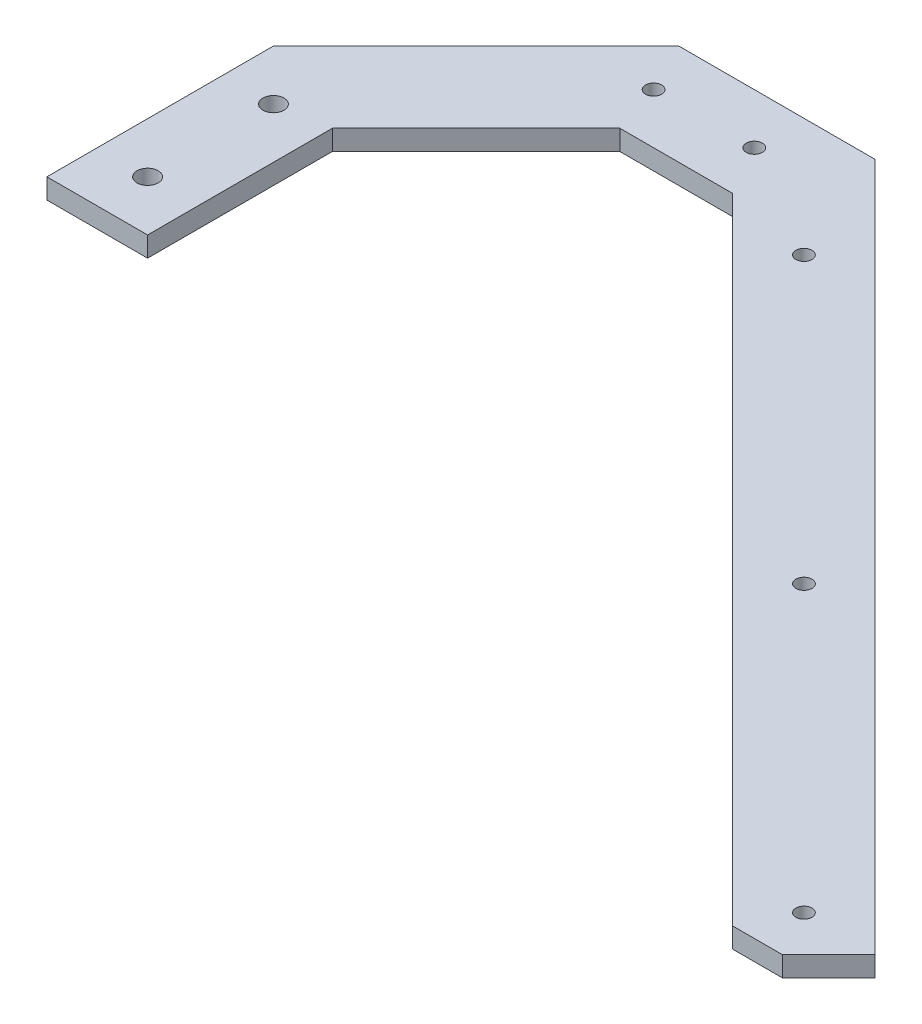
ISO-10303-21;
HEADER;
FILE_DESCRIPTION(('STEP AP214'),'2;1');
FILE_NAME('part.step','',(''),(''),'','','');
FILE_SCHEMA(('AUTOMOTIVE_DESIGN { 1 0 10303 214 1 1 1 1 }'));
ENDSEC;
DATA;
#1=APPLICATION_CONTEXT('core data for automotive mechanical design processes');
#2=APPLICATION_PROTOCOL_DEFINITION('international standard','automotive_design',2000,#1);
#3=PRODUCT_CONTEXT('',#1,'mechanical');
#4=PRODUCT('Part','Part','',(#3));
#5=PRODUCT_RELATED_PRODUCT_CATEGORY('part','',(#4));
#6=PRODUCT_DEFINITION_FORMATION('','',#4);
#7=PRODUCT_DEFINITION_CONTEXT('part definition',#1,'design');
#8=PRODUCT_DEFINITION('design','',#6,#7);
#9=PRODUCT_DEFINITION_SHAPE('','',#8);
#10=(LENGTH_UNIT() NAMED_UNIT(*) SI_UNIT(.MILLI.,.METRE.));
#11=(NAMED_UNIT(*) PLANE_ANGLE_UNIT() SI_UNIT($,.RADIAN.));
#12=(NAMED_UNIT(*) SI_UNIT($,.STERADIAN.) SOLID_ANGLE_UNIT());
#13=UNCERTAINTY_MEASURE_WITH_UNIT(LENGTH_MEASURE(1.E-05),#10,'distance_accuracy_value','');
#14=(GEOMETRIC_REPRESENTATION_CONTEXT(3) GLOBAL_UNCERTAINTY_ASSIGNED_CONTEXT((#13)) GLOBAL_UNIT_ASSIGNED_CONTEXT((#10,
#11,#12)) REPRESENTATION_CONTEXT('',''));
#15=CARTESIAN_POINT('',(0.,0.,0.));
#16=DIRECTION('',(0.,0.,1.));
#17=DIRECTION('',(1.,0.,0.));
#18=AXIS2_PLACEMENT_3D('',#15,#16,#17);
#19=CARTESIAN_POINT('',(0.,4.,0.));
#20=DIRECTION('',(0.,-1.,0.));
#21=DIRECTION('',(0.,0.,-1.));
#22=AXIS2_PLACEMENT_3D('',#19,#20,#21);
#23=PLANE('',#22);
#24=CARTESIAN_POINT('',(65.2499999999997,4.,-75.2499999999997));
#25=DIRECTION('',(0.,1.,0.));
#26=DIRECTION('',(0.,0.,1.));
#27=AXIS2_PLACEMENT_3D('',#24,#25,#26);
#28=CIRCLE('',#27,1.60000000000001);
#29=CARTESIAN_POINT('',(65.2499999999997,4.,-73.6499999999997));
#30=VERTEX_POINT('',#29);
#31=EDGE_CURVE('E192',#30,#30,#28,.T.);
#32=ORIENTED_EDGE('',*,*,#31,.F.);
#33=EDGE_LOOP('',(#32));
#34=FACE_BOUND('',#33,.T.);
#35=CARTESIAN_POINT('',(45.2499999999997,4.,-75.2499999999997));
#36=DIRECTION('',(0.,1.,0.));
#37=DIRECTION('',(0.,0.,1.));
#38=AXIS2_PLACEMENT_3D('',#35,#36,#37);
#39=CIRCLE('',#38,1.6);
#40=CARTESIAN_POINT('',(45.2499999999997,4.,-73.6499999999997));
#41=VERTEX_POINT('',#40);
#42=EDGE_CURVE('E197',#41,#41,#39,.T.);
#43=ORIENTED_EDGE('',*,*,#42,.F.);
#44=EDGE_LOOP('',(#43));
#45=FACE_BOUND('',#44,.T.);
#46=CARTESIAN_POINT('',(201.747474683057,4.,51.3896103067888));
#47=DIRECTION('',(0.,1.,0.));
#48=DIRECTION('',(0.,0.,1.));
#49=AXIS2_PLACEMENT_3D('',#46,#47,#48);
#50=CIRCLE('',#49,1.59999999999999);
#51=CARTESIAN_POINT('',(201.747474683057,4.,52.9896103067888));
#52=VERTEX_POINT('',#51);
#53=EDGE_CURVE('E190',#52,#52,#50,.T.);
#54=ORIENTED_EDGE('',*,*,#53,.F.);
#55=EDGE_LOOP('',(#54));
#56=FACE_BOUND('',#55,.T.);
#57=CARTESIAN_POINT('',(88.6103896932098,4.,-61.7474746830588));
#58=DIRECTION('',(0.,1.,0.));
#59=DIRECTION('',(0.,0.,1.));
#60=AXIS2_PLACEMENT_3D('',#57,#58,#59);
#61=CIRCLE('',#60,1.60000000000001);
#62=CARTESIAN_POINT('',(88.6103896932098,4.,-60.1474746830588));
#63=VERTEX_POINT('',#62);
#64=EDGE_CURVE('E219',#63,#63,#61,.T.);
#65=ORIENTED_EDGE('',*,*,#64,.F.);
#66=EDGE_LOOP('',(#65));
#67=FACE_BOUND('',#66,.T.);
#68=CARTESIAN_POINT('',(145.178932188134,4.,-5.17893218813499));
#69=DIRECTION('',(0.,1.,0.));
#70=DIRECTION('',(0.,0.,1.));
#71=AXIS2_PLACEMENT_3D('',#68,#69,#70);
#72=CIRCLE('',#71,1.59999999999999);
#73=CARTESIAN_POINT('',(145.178932188134,4.,-3.578932188135));
#74=VERTEX_POINT('',#73);
#75=EDGE_CURVE('E215',#74,#74,#72,.T.);
#76=ORIENTED_EDGE('',*,*,#75,.F.);
#77=EDGE_LOOP('',(#76));
#78=FACE_BOUND('',#77,.T.);
#79=DIRECTION('',(-1.,0.,0.));
#80=VECTOR('',#79,1.);
#81=CARTESIAN_POINT('',(225.25,4.,60.7499999999974));
#82=LINE('',#81,#80);
#83=CARTESIAN_POINT('',(206.86522368915,4.,60.7499999999979));
#84=VERTEX_POINT('',#83);
#85=CARTESIAN_POINT('',(196.965728752533,4.,60.7499999999982));
#86=VERTEX_POINT('',#85);
#87=EDGE_CURVE('E191',#84,#86,#82,.T.);
#88=ORIENTED_EDGE('',*,*,#87,.F.);
#89=DIRECTION('',(-0.707106781186547,0.,0.707106781186548));
#90=VECTOR('',#89,1.);
#91=CARTESIAN_POINT('',(216.057611844575,4.,51.5576118445722));
#92=LINE('',#91,#90);
#93=CARTESIAN_POINT('',(216.057611844575,4.,51.5576118445722));
#94=VERTEX_POINT('',#93);
#95=EDGE_CURVE('E57',#94,#84,#92,.T.);
#96=ORIENTED_EDGE('',*,*,#95,.F.);
#97=DIRECTION('',(-0.707106781186546,0.,-0.707106781186549));
#98=VECTOR('',#97,1.);
#99=CARTESIAN_POINT('',(79.2499999999998,4.,-85.2499999999997));
#100=LINE('',#99,#98);
#101=CARTESIAN_POINT('',(79.2499999999998,4.,-85.2499999999997));
#102=VERTEX_POINT('',#101);
#103=EDGE_CURVE('E122',#94,#102,#100,.T.);
#104=ORIENTED_EDGE('',*,*,#103,.T.);
#105=DIRECTION('',(-1.,0.,0.));
#106=VECTOR('',#105,1.);
#107=CARTESIAN_POINT('',(40.2499999999997,4.,-85.2499999999997));
#108=LINE('',#107,#106);
#109=CARTESIAN_POINT('',(40.2499999999997,4.,-85.2499999999997));
#110=VERTEX_POINT('',#109);
#111=EDGE_CURVE('E129',#102,#110,#108,.T.);
#112=ORIENTED_EDGE('',*,*,#111,.T.);
#113=DIRECTION('',(-0.707106781186548,0.,0.707106781186548));
#114=VECTOR('',#113,1.);
#115=CARTESIAN_POINT('',(0.,4.,-45.));
#116=LINE('',#115,#114);
#117=CARTESIAN_POINT('',(0.,4.,-45.));
#118=VERTEX_POINT('',#117);
#119=EDGE_CURVE('E63',#110,#118,#116,.T.);
#120=ORIENTED_EDGE('',*,*,#119,.T.);
#121=DIRECTION('',(0.,0.,1.));
#122=VECTOR('',#121,1.);
#123=CARTESIAN_POINT('',(0.,4.,0.));
#124=LINE('',#123,#122);
#125=CARTESIAN_POINT('',(0.,4.,0.));
#126=VERTEX_POINT('',#125);
#127=EDGE_CURVE('E166',#118,#126,#124,.T.);
#128=ORIENTED_EDGE('',*,*,#127,.T.);
#129=DIRECTION('',(1.,0.,0.));
#130=VECTOR('',#129,1.);
#131=CARTESIAN_POINT('',(20.,4.,0.));
#132=LINE('',#131,#130);
#133=CARTESIAN_POINT('',(20.,4.,0.));
#134=VERTEX_POINT('',#133);
#135=EDGE_CURVE('E106',#126,#134,#132,.T.);
#136=ORIENTED_EDGE('',*,*,#135,.T.);
#137=DIRECTION('',(0.,0.,-1.));
#138=VECTOR('',#137,1.);
#139=CARTESIAN_POINT('',(20.,4.,-36.7157287525381));
#140=LINE('',#139,#138);
#141=CARTESIAN_POINT('',(20.,4.,-36.7157287525381));
#142=VERTEX_POINT('',#141);
#143=EDGE_CURVE('E245',#134,#142,#140,.T.);
#144=ORIENTED_EDGE('',*,*,#143,.T.);
#145=DIRECTION('',(0.707106781186548,0.,-0.707106781186547));
#146=VECTOR('',#145,1.);
#147=CARTESIAN_POINT('',(48.5342712474616,4.,-65.2499999999997));
#148=LINE('',#147,#146);
#149=CARTESIAN_POINT('',(48.5342712474616,4.,-65.2499999999997));
#150=VERTEX_POINT('',#149);
#151=EDGE_CURVE('E242',#142,#150,#148,.T.);
#152=ORIENTED_EDGE('',*,*,#151,.T.);
#153=DIRECTION('',(1.,0.,0.));
#154=VECTOR('',#153,1.);
#155=CARTESIAN_POINT('',(48.5342712474616,4.,-65.2499999999997));
#156=LINE('',#155,#154);
#157=CARTESIAN_POINT('',(70.9657287525379,4.,-65.2499999999997));
#158=VERTEX_POINT('',#157);
#159=EDGE_CURVE('E246',#150,#158,#156,.T.);
#160=ORIENTED_EDGE('',*,*,#159,.T.);
#161=DIRECTION('',(0.707106781186547,0.,0.707106781186549));
#162=VECTOR('',#161,1.);
#163=CARTESIAN_POINT('',(70.9657287525379,4.,-65.2499999999997));
#164=LINE('',#163,#162);
#165=EDGE_CURVE('E134',#158,#86,#164,.T.);
#166=ORIENTED_EDGE('',*,*,#165,.T.);
#167=EDGE_LOOP('',(#88,#96,#104,#112,#120,#128,#136,#144,#152,#160,#166));
#168=FACE_BOUND('',#167,.T.);
#169=CARTESIAN_POINT('',(10.,4.,-10.));
#170=DIRECTION('',(0.,1.,0.));
#171=DIRECTION('',(0.,0.,1.));
#172=AXIS2_PLACEMENT_3D('',#169,#170,#171);
#173=CIRCLE('',#172,2.1);
#174=CARTESIAN_POINT('',(10.,4.,-7.9));
#175=VERTEX_POINT('',#174);
#176=EDGE_CURVE('E155',#175,#175,#173,.T.);
#177=ORIENTED_EDGE('',*,*,#176,.F.);
#178=EDGE_LOOP('',(#177));
#179=FACE_BOUND('',#178,.T.);
#180=CARTESIAN_POINT('',(10.,4.,-35.));
#181=DIRECTION('',(0.,1.,0.));
#182=DIRECTION('',(0.,0.,-1.));
#183=AXIS2_PLACEMENT_3D('',#180,#181,#182);
#184=CIRCLE('',#183,2.1);
#185=CARTESIAN_POINT('',(10.,4.,-37.1));
#186=VERTEX_POINT('',#185);
#187=EDGE_CURVE('E229',#186,#186,#184,.T.);
#188=ORIENTED_EDGE('',*,*,#187,.F.);
#189=EDGE_LOOP('',(#188));
#190=FACE_BOUND('',#189,.T.);
#191=ADVANCED_FACE('F39',(#34,#45,#56,#67,#78,#168,#179,#190),#23,.F.);
#192=CARTESIAN_POINT('',(0.,0.,0.));
#193=DIRECTION('',(0.,-1.,0.));
#194=DIRECTION('',(0.,0.,-1.));
#195=AXIS2_PLACEMENT_3D('',#192,#193,#194);
#196=PLANE('',#195);
#197=CARTESIAN_POINT('',(65.2499999999997,0.,-75.2499999999997));
#198=DIRECTION('',(0.,-1.,0.));
#199=DIRECTION('',(0.,0.,-1.));
#200=AXIS2_PLACEMENT_3D('',#197,#198,#199);
#201=CIRCLE('',#200,1.60000000000001);
#202=CARTESIAN_POINT('',(65.2499999999997,0.,-76.8499999999997));
#203=VERTEX_POINT('',#202);
#204=EDGE_CURVE('E43',#203,#203,#201,.T.);
#205=ORIENTED_EDGE('',*,*,#204,.F.);
#206=EDGE_LOOP('',(#205));
#207=FACE_BOUND('',#206,.T.);
#208=CARTESIAN_POINT('',(45.2499999999997,0.,-75.2499999999997));
#209=DIRECTION('',(0.,-1.,0.));
#210=DIRECTION('',(0.,0.,-1.));
#211=AXIS2_PLACEMENT_3D('',#208,#209,#210);
#212=CIRCLE('',#211,1.6);
#213=CARTESIAN_POINT('',(45.2499999999997,0.,-76.8499999999997));
#214=VERTEX_POINT('',#213);
#215=EDGE_CURVE('E195',#214,#214,#212,.T.);
#216=ORIENTED_EDGE('',*,*,#215,.F.);
#217=EDGE_LOOP('',(#216));
#218=FACE_BOUND('',#217,.T.);
#219=DIRECTION('',(0.707106781186547,0.,-0.707106781186548));
#220=VECTOR('',#219,1.);
#221=CARTESIAN_POINT('',(133.807611844574,0.,133.807611844573));
#222=LINE('',#221,#220);
#223=CARTESIAN_POINT('',(206.86522368915,0.,60.7499999999974));
#224=VERTEX_POINT('',#223);
#225=CARTESIAN_POINT('',(216.057611844575,0.,51.5576118445722));
#226=VERTEX_POINT('',#225);
#227=EDGE_CURVE('E208',#224,#226,#222,.T.);
#228=ORIENTED_EDGE('',*,*,#227,.F.);
#229=DIRECTION('',(1.,0.,0.));
#230=VECTOR('',#229,1.);
#231=CARTESIAN_POINT('',(1.81824066523964E-12,0.,60.7500000000041));
#232=LINE('',#231,#230);
#233=CARTESIAN_POINT('',(196.965728752533,0.,60.7499999999982));
#234=VERTEX_POINT('',#233);
#235=EDGE_CURVE('E228',#234,#224,#232,.T.);
#236=ORIENTED_EDGE('',*,*,#235,.F.);
#237=DIRECTION('',(0.707106781186547,0.,0.707106781186549));
#238=VECTOR('',#237,1.);
#239=CARTESIAN_POINT('',(70.9657287525379,0.,-65.2499999999997));
#240=LINE('',#239,#238);
#241=CARTESIAN_POINT('',(70.9657287525379,0.,-65.2499999999997));
#242=VERTEX_POINT('',#241);
#243=EDGE_CURVE('E163',#242,#234,#240,.T.);
#244=ORIENTED_EDGE('',*,*,#243,.F.);
#245=DIRECTION('',(1.,0.,0.));
#246=VECTOR('',#245,1.);
#247=CARTESIAN_POINT('',(48.5342712474616,0.,-65.2499999999997));
#248=LINE('',#247,#246);
#249=CARTESIAN_POINT('',(48.5342712474616,0.,-65.2499999999997));
#250=VERTEX_POINT('',#249);
#251=EDGE_CURVE('E156',#250,#242,#248,.T.);
#252=ORIENTED_EDGE('',*,*,#251,.F.);
#253=DIRECTION('',(0.707106781186548,0.,-0.707106781186547));
#254=VECTOR('',#253,1.);
#255=CARTESIAN_POINT('',(48.5342712474616,0.,-65.2499999999997));
#256=LINE('',#255,#254);
#257=CARTESIAN_POINT('',(20.,0.,-36.7157287525381));
#258=VERTEX_POINT('',#257);
#259=EDGE_CURVE('E160',#258,#250,#256,.T.);
#260=ORIENTED_EDGE('',*,*,#259,.F.);
#261=DIRECTION('',(0.,0.,-1.));
#262=VECTOR('',#261,1.);
#263=CARTESIAN_POINT('',(20.,0.,-36.7157287525381));
#264=LINE('',#263,#262);
#265=CARTESIAN_POINT('',(20.,0.,0.));
#266=VERTEX_POINT('',#265);
#267=EDGE_CURVE('E152',#266,#258,#264,.T.);
#268=ORIENTED_EDGE('',*,*,#267,.F.);
#269=DIRECTION('',(1.,0.,0.));
#270=VECTOR('',#269,1.);
#271=CARTESIAN_POINT('',(20.,0.,0.));
#272=LINE('',#271,#270);
#273=CARTESIAN_POINT('',(0.,0.,0.));
#274=VERTEX_POINT('',#273);
#275=EDGE_CURVE('E151',#274,#266,#272,.T.);
#276=ORIENTED_EDGE('',*,*,#275,.F.);
#277=DIRECTION('',(0.,0.,1.));
#278=VECTOR('',#277,1.);
#279=CARTESIAN_POINT('',(0.,0.,0.));
#280=LINE('',#279,#278);
#281=CARTESIAN_POINT('',(0.,0.,-45.));
#282=VERTEX_POINT('',#281);
#283=EDGE_CURVE('E148',#282,#274,#280,.T.);
#284=ORIENTED_EDGE('',*,*,#283,.F.);
#285=DIRECTION('',(-0.707106781186548,0.,0.707106781186548));
#286=VECTOR('',#285,1.);
#287=CARTESIAN_POINT('',(0.,0.,-45.));
#288=LINE('',#287,#286);
#289=CARTESIAN_POINT('',(40.2499999999997,0.,-85.2499999999997));
#290=VERTEX_POINT('',#289);
#291=EDGE_CURVE('E97',#290,#282,#288,.T.);
#292=ORIENTED_EDGE('',*,*,#291,.F.);
#293=DIRECTION('',(-1.,0.,0.));
#294=VECTOR('',#293,1.);
#295=CARTESIAN_POINT('',(40.2499999999997,0.,-85.2499999999997));
#296=LINE('',#295,#294);
#297=CARTESIAN_POINT('',(79.2499999999998,0.,-85.2499999999997));
#298=VERTEX_POINT('',#297);
#299=EDGE_CURVE('E164',#298,#290,#296,.T.);
#300=ORIENTED_EDGE('',*,*,#299,.F.);
#301=DIRECTION('',(-0.707106781186546,0.,-0.707106781186549));
#302=VECTOR('',#301,1.);
#303=CARTESIAN_POINT('',(79.2499999999998,0.,-85.2499999999997));
#304=LINE('',#303,#302);
#305=EDGE_CURVE('E140',#226,#298,#304,.T.);
#306=ORIENTED_EDGE('',*,*,#305,.F.);
#307=EDGE_LOOP('',(#228,#236,#244,#252,#260,#268,#276,#284,#292,#300,#306));
#308=FACE_BOUND('',#307,.T.);
#309=CARTESIAN_POINT('',(201.747474683057,0.,51.3896103067888));
#310=DIRECTION('',(0.,-1.,0.));
#311=DIRECTION('',(0.,0.,-1.));
#312=AXIS2_PLACEMENT_3D('',#309,#310,#311);
#313=CIRCLE('',#312,1.59999999999999);
#314=CARTESIAN_POINT('',(201.747474683057,0.,49.7896103067888));
#315=VERTEX_POINT('',#314);
#316=EDGE_CURVE('E188',#315,#315,#313,.T.);
#317=ORIENTED_EDGE('',*,*,#316,.F.);
#318=EDGE_LOOP('',(#317));
#319=FACE_BOUND('',#318,.T.);
#320=CARTESIAN_POINT('',(88.6103896932098,0.,-61.7474746830588));
#321=DIRECTION('',(0.,-1.,0.));
#322=DIRECTION('',(0.,0.,-1.));
#323=AXIS2_PLACEMENT_3D('',#320,#321,#322);
#324=CIRCLE('',#323,1.60000000000001);
#325=CARTESIAN_POINT('',(88.6103896932098,0.,-63.3474746830588));
#326=VERTEX_POINT('',#325);
#327=EDGE_CURVE('E187',#326,#326,#324,.T.);
#328=ORIENTED_EDGE('',*,*,#327,.F.);
#329=EDGE_LOOP('',(#328));
#330=FACE_BOUND('',#329,.T.);
#331=CARTESIAN_POINT('',(145.178932188134,0.,-5.17893218813499));
#332=DIRECTION('',(0.,-1.,0.));
#333=DIRECTION('',(0.,0.,-1.));
#334=AXIS2_PLACEMENT_3D('',#331,#332,#333);
#335=CIRCLE('',#334,1.59999999999999);
#336=CARTESIAN_POINT('',(145.178932188134,0.,-6.77893218813498));
#337=VERTEX_POINT('',#336);
#338=EDGE_CURVE('E182',#337,#337,#335,.T.);
#339=ORIENTED_EDGE('',*,*,#338,.F.);
#340=EDGE_LOOP('',(#339));
#341=FACE_BOUND('',#340,.T.);
#342=CARTESIAN_POINT('',(10.,0.,-10.));
#343=DIRECTION('',(0.,1.,0.));
#344=DIRECTION('',(0.,0.,1.));
#345=AXIS2_PLACEMENT_3D('',#342,#343,#344);
#346=CIRCLE('',#345,2.1);
#347=CARTESIAN_POINT('',(10.,0.,-7.9));
#348=VERTEX_POINT('',#347);
#349=EDGE_CURVE('E231',#348,#348,#346,.T.);
#350=ORIENTED_EDGE('',*,*,#349,.T.);
#351=EDGE_LOOP('',(#350));
#352=FACE_BOUND('',#351,.T.);
#353=CARTESIAN_POINT('',(10.,0.,-35.));
#354=DIRECTION('',(0.,1.,0.));
#355=DIRECTION('',(0.,0.,-1.));
#356=AXIS2_PLACEMENT_3D('',#353,#354,#355);
#357=CIRCLE('',#356,2.1);
#358=CARTESIAN_POINT('',(10.,0.,-37.1));
#359=VERTEX_POINT('',#358);
#360=EDGE_CURVE('E230',#359,#359,#357,.T.);
#361=ORIENTED_EDGE('',*,*,#360,.T.);
#362=EDGE_LOOP('',(#361));
#363=FACE_BOUND('',#362,.T.);
#364=ADVANCED_FACE('F261',(#207,#218,#308,#319,#330,#341,#352,#363),#196,.T.);
#365=CARTESIAN_POINT('',(0.,4.,0.));
#366=DIRECTION('',(1.,0.,0.));
#367=DIRECTION('',(0.,0.,-1.));
#368=AXIS2_PLACEMENT_3D('',#365,#366,#367);
#369=PLANE('',#368);
#370=ORIENTED_EDGE('',*,*,#283,.T.);
#371=DIRECTION('',(0.,-1.,0.));
#372=VECTOR('',#371,1.);
#373=CARTESIAN_POINT('',(0.,4.,0.));
#374=LINE('',#373,#372);
#375=EDGE_CURVE('E48',#126,#274,#374,.T.);
#376=ORIENTED_EDGE('',*,*,#375,.F.);
#377=ORIENTED_EDGE('',*,*,#127,.F.);
#378=DIRECTION('',(0.,-1.,0.));
#379=VECTOR('',#378,1.);
#380=CARTESIAN_POINT('',(0.,4.,-45.));
#381=LINE('',#380,#379);
#382=EDGE_CURVE('E143',#118,#282,#381,.T.);
#383=ORIENTED_EDGE('',*,*,#382,.T.);
#384=EDGE_LOOP('',(#370,#376,#377,#383));
#385=FACE_BOUND('',#384,.T.);
#386=ADVANCED_FACE('F41',(#385),#369,.F.);
#387=CARTESIAN_POINT('',(20.,4.,0.));
#388=DIRECTION('',(0.,0.,-1.));
#389=DIRECTION('',(-1.,0.,0.));
#390=AXIS2_PLACEMENT_3D('',#387,#388,#389);
#391=PLANE('',#390);
#392=ORIENTED_EDGE('',*,*,#275,.T.);
#393=DIRECTION('',(0.,-1.,0.));
#394=VECTOR('',#393,1.);
#395=CARTESIAN_POINT('',(20.,4.,0.));
#396=LINE('',#395,#394);
#397=EDGE_CURVE('E177',#134,#266,#396,.T.);
#398=ORIENTED_EDGE('',*,*,#397,.F.);
#399=ORIENTED_EDGE('',*,*,#135,.F.);
#400=ORIENTED_EDGE('',*,*,#375,.T.);
#401=EDGE_LOOP('',(#392,#398,#399,#400));
#402=FACE_BOUND('',#401,.T.);
#403=ADVANCED_FACE('F317',(#402),#391,.F.);
#404=CARTESIAN_POINT('',(20.,4.,-36.7157287525381));
#405=DIRECTION('',(-1.,0.,0.));
#406=DIRECTION('',(0.,0.,1.));
#407=AXIS2_PLACEMENT_3D('',#404,#405,#406);
#408=PLANE('',#407);
#409=ORIENTED_EDGE('',*,*,#267,.T.);
#410=DIRECTION('',(0.,-1.,0.));
#411=VECTOR('',#410,1.);
#412=CARTESIAN_POINT('',(20.,4.,-36.7157287525381));
#413=LINE('',#412,#411);
#414=EDGE_CURVE('E176',#142,#258,#413,.T.);
#415=ORIENTED_EDGE('',*,*,#414,.F.);
#416=ORIENTED_EDGE('',*,*,#143,.F.);
#417=ORIENTED_EDGE('',*,*,#397,.T.);
#418=EDGE_LOOP('',(#409,#415,#416,#417));
#419=FACE_BOUND('',#418,.T.);
#420=ADVANCED_FACE('F312',(#419),#408,.F.);
#421=CARTESIAN_POINT('',(48.5342712474616,4.,-65.2499999999997));
#422=DIRECTION('',(-0.707106781186547,0.,-0.707106781186548));
#423=DIRECTION('',(-0.707106781186548,0.,0.707106781186547));
#424=AXIS2_PLACEMENT_3D('',#421,#422,#423);
#425=PLANE('',#424);
#426=ORIENTED_EDGE('',*,*,#259,.T.);
#427=DIRECTION('',(0.,-1.,0.));
#428=VECTOR('',#427,1.);
#429=CARTESIAN_POINT('',(48.5342712474616,4.,-65.2499999999997));
#430=LINE('',#429,#428);
#431=EDGE_CURVE('E173',#150,#250,#430,.T.);
#432=ORIENTED_EDGE('',*,*,#431,.F.);
#433=ORIENTED_EDGE('',*,*,#151,.F.);
#434=ORIENTED_EDGE('',*,*,#414,.T.);
#435=EDGE_LOOP('',(#426,#432,#433,#434));
#436=FACE_BOUND('',#435,.T.);
#437=ADVANCED_FACE('F307',(#436),#425,.F.);
#438=CARTESIAN_POINT('',(48.5342712474616,4.,-65.2499999999997));
#439=DIRECTION('',(0.,0.,-1.));
#440=DIRECTION('',(-1.,0.,0.));
#441=AXIS2_PLACEMENT_3D('',#438,#439,#440);
#442=PLANE('',#441);
#443=ORIENTED_EDGE('',*,*,#251,.T.);
#444=DIRECTION('',(0.,-1.,0.));
#445=VECTOR('',#444,1.);
#446=CARTESIAN_POINT('',(70.9657287525379,4.,-65.2499999999997));
#447=LINE('',#446,#445);
#448=EDGE_CURVE('E138',#158,#242,#447,.T.);
#449=ORIENTED_EDGE('',*,*,#448,.F.);
#450=ORIENTED_EDGE('',*,*,#159,.F.);
#451=ORIENTED_EDGE('',*,*,#431,.T.);
#452=EDGE_LOOP('',(#443,#449,#450,#451));
#453=FACE_BOUND('',#452,.T.);
#454=ADVANCED_FACE('F306',(#453),#442,.F.);
#455=CARTESIAN_POINT('',(70.9657287525379,4.,-65.2499999999997));
#456=DIRECTION('',(0.707106781186549,0.,-0.707106781186547));
#457=DIRECTION('',(-0.707106781186546,0.,-0.707106781186549));
#458=AXIS2_PLACEMENT_3D('',#455,#456,#457);
#459=PLANE('',#458);
#460=ORIENTED_EDGE('',*,*,#243,.T.);
#461=DIRECTION('',(0.,1.,0.));
#462=VECTOR('',#461,1.);
#463=CARTESIAN_POINT('',(196.965728752533,-6.,60.7499999999982));
#464=LINE('',#463,#462);
#465=EDGE_CURVE('E224',#234,#86,#464,.T.);
#466=ORIENTED_EDGE('',*,*,#465,.T.);
#467=ORIENTED_EDGE('',*,*,#165,.F.);
#468=ORIENTED_EDGE('',*,*,#448,.T.);
#469=EDGE_LOOP('',(#460,#466,#467,#468));
#470=FACE_BOUND('',#469,.T.);
#471=ADVANCED_FACE('F251',(#470),#459,.F.);
#472=CARTESIAN_POINT('',(79.2499999999998,4.,-85.2499999999997));
#473=DIRECTION('',(-0.707106781186549,0.,0.707106781186546));
#474=DIRECTION('',(0.707106781186546,0.,0.707106781186549));
#475=AXIS2_PLACEMENT_3D('',#472,#473,#474);
#476=PLANE('',#475);
#477=ORIENTED_EDGE('',*,*,#103,.F.);
#478=DIRECTION('',(0.,1.,0.));
#479=VECTOR('',#478,1.);
#480=CARTESIAN_POINT('',(216.057611844575,-46.,51.5576118445722));
#481=LINE('',#480,#479);
#482=EDGE_CURVE('E206',#226,#94,#481,.T.);
#483=ORIENTED_EDGE('',*,*,#482,.F.);
#484=ORIENTED_EDGE('',*,*,#305,.T.);
#485=DIRECTION('',(0.,-1.,0.));
#486=VECTOR('',#485,1.);
#487=CARTESIAN_POINT('',(79.2499999999998,4.,-85.2499999999997));
#488=LINE('',#487,#486);
#489=EDGE_CURVE('E133',#102,#298,#488,.T.);
#490=ORIENTED_EDGE('',*,*,#489,.F.);
#491=EDGE_LOOP('',(#477,#483,#484,#490));
#492=FACE_BOUND('',#491,.T.);
#493=ADVANCED_FACE('F132',(#492),#476,.F.);
#494=CARTESIAN_POINT('',(40.2499999999997,4.,-85.2499999999997));
#495=DIRECTION('',(0.,0.,1.));
#496=DIRECTION('',(1.,0.,0.));
#497=AXIS2_PLACEMENT_3D('',#494,#495,#496);
#498=PLANE('',#497);
#499=ORIENTED_EDGE('',*,*,#299,.T.);
#500=DIRECTION('',(0.,-1.,0.));
#501=VECTOR('',#500,1.);
#502=CARTESIAN_POINT('',(40.2499999999997,4.,-85.2499999999997));
#503=LINE('',#502,#501);
#504=EDGE_CURVE('E142',#110,#290,#503,.T.);
#505=ORIENTED_EDGE('',*,*,#504,.F.);
#506=ORIENTED_EDGE('',*,*,#111,.F.);
#507=ORIENTED_EDGE('',*,*,#489,.T.);
#508=EDGE_LOOP('',(#499,#505,#506,#507));
#509=FACE_BOUND('',#508,.T.);
#510=ADVANCED_FACE('F141',(#509),#498,.F.);
#511=CARTESIAN_POINT('',(0.,4.,-45.));
#512=DIRECTION('',(0.707106781186547,0.,0.707106781186548));
#513=DIRECTION('',(0.707106781186548,0.,-0.707106781186547));
#514=AXIS2_PLACEMENT_3D('',#511,#512,#513);
#515=PLANE('',#514);
#516=ORIENTED_EDGE('',*,*,#291,.T.);
#517=ORIENTED_EDGE('',*,*,#382,.F.);
#518=ORIENTED_EDGE('',*,*,#119,.F.);
#519=ORIENTED_EDGE('',*,*,#504,.T.);
#520=EDGE_LOOP('',(#516,#517,#518,#519));
#521=FACE_BOUND('',#520,.T.);
#522=ADVANCED_FACE('F300',(#521),#515,.F.);
#523=CARTESIAN_POINT('',(10.,4.,-10.));
#524=DIRECTION('',(0.,-1.,0.));
#525=DIRECTION('',(0.,0.,-1.));
#526=AXIS2_PLACEMENT_3D('',#523,#524,#525);
#527=CYLINDRICAL_SURFACE('',#526,2.1);
#528=ORIENTED_EDGE('',*,*,#176,.T.);
#529=EDGE_LOOP('',(#528));
#530=FACE_BOUND('',#529,.T.);
#531=ORIENTED_EDGE('',*,*,#349,.F.);
#532=EDGE_LOOP('',(#531));
#533=FACE_BOUND('',#532,.T.);
#534=ADVANCED_FACE('F295',(#530,#533),#527,.F.);
#535=CARTESIAN_POINT('',(10.,4.,-35.));
#536=DIRECTION('',(0.,-1.,0.));
#537=DIRECTION('',(0.,0.,-1.));
#538=AXIS2_PLACEMENT_3D('',#535,#536,#537);
#539=CYLINDRICAL_SURFACE('',#538,2.1);
#540=ORIENTED_EDGE('',*,*,#187,.T.);
#541=EDGE_LOOP('',(#540));
#542=FACE_BOUND('',#541,.T.);
#543=ORIENTED_EDGE('',*,*,#360,.F.);
#544=EDGE_LOOP('',(#543));
#545=FACE_BOUND('',#544,.T.);
#546=ADVANCED_FACE('F397',(#542,#545),#539,.F.);
#547=CARTESIAN_POINT('',(225.25,-6.,60.7499999999974));
#548=DIRECTION('',(0.,0.,-1.));
#549=DIRECTION('',(-1.,0.,0.));
#550=AXIS2_PLACEMENT_3D('',#547,#548,#549);
#551=PLANE('',#550);
#552=ORIENTED_EDGE('',*,*,#235,.T.);
#553=DIRECTION('',(0.,1.,0.));
#554=VECTOR('',#553,1.);
#555=CARTESIAN_POINT('',(206.865223689149,-6.,60.7499999999979));
#556=LINE('',#555,#554);
#557=EDGE_CURVE('E11',#224,#84,#556,.T.);
#558=ORIENTED_EDGE('',*,*,#557,.T.);
#559=ORIENTED_EDGE('',*,*,#87,.T.);
#560=ORIENTED_EDGE('',*,*,#465,.F.);
#561=EDGE_LOOP('',(#552,#558,#559,#560));
#562=FACE_BOUND('',#561,.T.);
#563=ADVANCED_FACE('F258',(#562),#551,.F.);
#564=CARTESIAN_POINT('',(145.178932188134,-46.,-5.17893218813499));
#565=DIRECTION('',(0.,1.,0.));
#566=DIRECTION('',(0.,0.,1.));
#567=AXIS2_PLACEMENT_3D('',#564,#565,#566);
#568=CYLINDRICAL_SURFACE('',#567,1.59999999999999);
#569=ORIENTED_EDGE('',*,*,#338,.T.);
#570=EDGE_LOOP('',(#569));
#571=FACE_BOUND('',#570,.T.);
#572=ORIENTED_EDGE('',*,*,#75,.T.);
#573=EDGE_LOOP('',(#572));
#574=FACE_BOUND('',#573,.T.);
#575=ADVANCED_FACE('F414',(#571,#574),#568,.F.);
#576=CARTESIAN_POINT('',(88.6103896932098,-46.,-61.7474746830588));
#577=DIRECTION('',(0.,1.,0.));
#578=DIRECTION('',(0.,0.,1.));
#579=AXIS2_PLACEMENT_3D('',#576,#577,#578);
#580=CYLINDRICAL_SURFACE('',#579,1.60000000000001);
#581=ORIENTED_EDGE('',*,*,#327,.T.);
#582=EDGE_LOOP('',(#581));
#583=FACE_BOUND('',#582,.T.);
#584=ORIENTED_EDGE('',*,*,#64,.T.);
#585=EDGE_LOOP('',(#584));
#586=FACE_BOUND('',#585,.T.);
#587=ADVANCED_FACE('F281',(#583,#586),#580,.F.);
#588=CARTESIAN_POINT('',(201.747474683057,-46.,51.3896103067888));
#589=DIRECTION('',(0.,1.,0.));
#590=DIRECTION('',(0.,0.,1.));
#591=AXIS2_PLACEMENT_3D('',#588,#589,#590);
#592=CYLINDRICAL_SURFACE('',#591,1.59999999999999);
#593=ORIENTED_EDGE('',*,*,#316,.T.);
#594=EDGE_LOOP('',(#593));
#595=FACE_BOUND('',#594,.T.);
#596=ORIENTED_EDGE('',*,*,#53,.T.);
#597=EDGE_LOOP('',(#596));
#598=FACE_BOUND('',#597,.T.);
#599=ADVANCED_FACE('F275',(#595,#598),#592,.F.);
#600=CARTESIAN_POINT('',(216.057611844575,-46.,51.5576118445722));
#601=DIRECTION('',(-0.707106781186548,0.,-0.707106781186547));
#602=DIRECTION('',(-0.707106781186547,0.,0.707106781186548));
#603=AXIS2_PLACEMENT_3D('',#600,#601,#602);
#604=PLANE('',#603);
#605=ORIENTED_EDGE('',*,*,#227,.T.);
#606=ORIENTED_EDGE('',*,*,#482,.T.);
#607=ORIENTED_EDGE('',*,*,#95,.T.);
#608=ORIENTED_EDGE('',*,*,#557,.F.);
#609=EDGE_LOOP('',(#605,#606,#607,#608));
#610=FACE_BOUND('',#609,.T.);
#611=ADVANCED_FACE('F270',(#610),#604,.F.);
#612=CARTESIAN_POINT('',(45.2499999999997,-46.,-75.2499999999997));
#613=DIRECTION('',(0.,1.,0.));
#614=DIRECTION('',(0.,0.,1.));
#615=AXIS2_PLACEMENT_3D('',#612,#613,#614);
#616=CYLINDRICAL_SURFACE('',#615,1.6);
#617=ORIENTED_EDGE('',*,*,#215,.T.);
#618=EDGE_LOOP('',(#617));
#619=FACE_BOUND('',#618,.T.);
#620=ORIENTED_EDGE('',*,*,#42,.T.);
#621=EDGE_LOOP('',(#620));
#622=FACE_BOUND('',#621,.T.);
#623=ADVANCED_FACE('F272',(#619,#622),#616,.F.);
#624=CARTESIAN_POINT('',(65.2499999999997,-46.,-75.2499999999997));
#625=DIRECTION('',(0.,1.,0.));
#626=DIRECTION('',(0.,0.,1.));
#627=AXIS2_PLACEMENT_3D('',#624,#625,#626);
#628=CYLINDRICAL_SURFACE('',#627,1.60000000000001);
#629=ORIENTED_EDGE('',*,*,#204,.T.);
#630=EDGE_LOOP('',(#629));
#631=FACE_BOUND('',#630,.T.);
#632=ORIENTED_EDGE('',*,*,#31,.T.);
#633=EDGE_LOOP('',(#632));
#634=FACE_BOUND('',#633,.T.);
#635=ADVANCED_FACE('F278',(#631,#634),#628,.F.);
#636=CLOSED_SHELL('',(#191,#364,#386,#403,#420,#437,#454,#471,#493,#510,#522,#534,#546,#563,
#575,#587,#599,#611,#623,#635));
#637=MANIFOLD_SOLID_BREP('B2',#636);
#638=ADVANCED_BREP_SHAPE_REPRESENTATION('',(#18,#637),#14);
#639=SHAPE_DEFINITION_REPRESENTATION(#9,#638);
ENDSEC;
END-ISO-10303-21;
